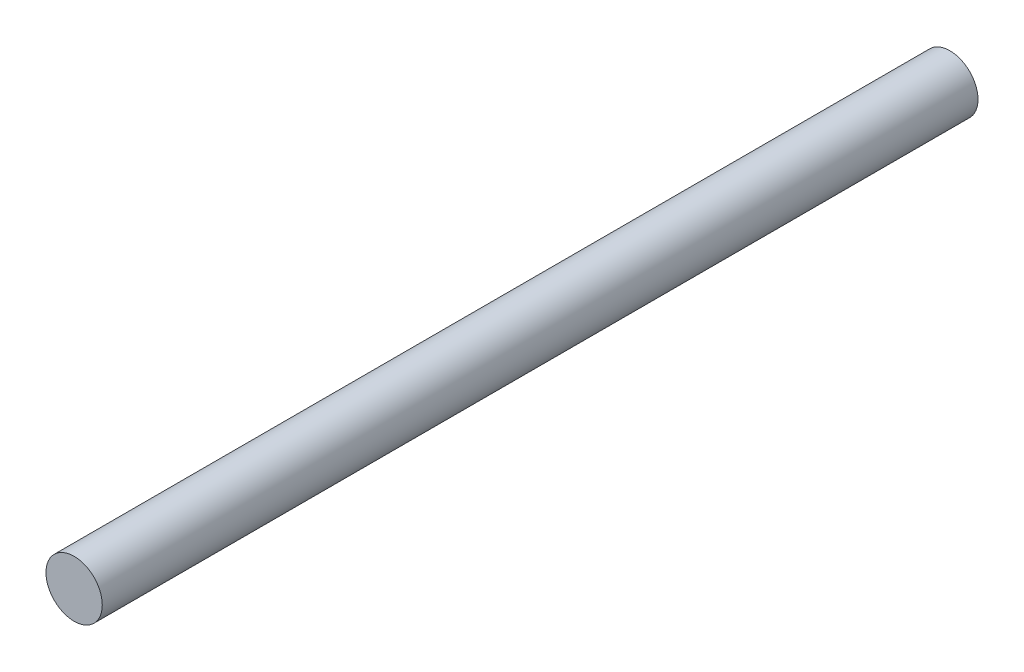
ISO-10303-21;
HEADER;
FILE_DESCRIPTION(('STEP AP214'),'2;1');
FILE_NAME('part.step','',(''),(''),'','','');
FILE_SCHEMA(('AUTOMOTIVE_DESIGN { 1 0 10303 214 1 1 1 1 }'));
ENDSEC;
DATA;
#1=APPLICATION_CONTEXT('core data for automotive mechanical design processes');
#2=APPLICATION_PROTOCOL_DEFINITION('international standard','automotive_design',2000,#1);
#3=PRODUCT_CONTEXT('',#1,'mechanical');
#4=PRODUCT('Part','Part','',(#3));
#5=PRODUCT_RELATED_PRODUCT_CATEGORY('part','',(#4));
#6=PRODUCT_DEFINITION_FORMATION('','',#4);
#7=PRODUCT_DEFINITION_CONTEXT('part definition',#1,'design');
#8=PRODUCT_DEFINITION('design','',#6,#7);
#9=PRODUCT_DEFINITION_SHAPE('','',#8);
#10=(LENGTH_UNIT() NAMED_UNIT(*) SI_UNIT(.MILLI.,.METRE.));
#11=(NAMED_UNIT(*) PLANE_ANGLE_UNIT() SI_UNIT($,.RADIAN.));
#12=(NAMED_UNIT(*) SI_UNIT($,.STERADIAN.) SOLID_ANGLE_UNIT());
#13=UNCERTAINTY_MEASURE_WITH_UNIT(LENGTH_MEASURE(1.E-05),#10,'distance_accuracy_value','');
#14=(GEOMETRIC_REPRESENTATION_CONTEXT(3) GLOBAL_UNCERTAINTY_ASSIGNED_CONTEXT((#13)) GLOBAL_UNIT_ASSIGNED_CONTEXT((#10,
#11,#12)) REPRESENTATION_CONTEXT('',''));
#15=CARTESIAN_POINT('',(0.,0.,0.));
#16=DIRECTION('',(0.,0.,1.));
#17=DIRECTION('',(1.,0.,0.));
#18=AXIS2_PLACEMENT_3D('',#15,#16,#17);
#19=CARTESIAN_POINT('',(0.,0.,-243.2));
#20=DIRECTION('',(0.,0.,1.));
#21=DIRECTION('',(1.,0.,0.));
#22=AXIS2_PLACEMENT_3D('',#19,#20,#21);
#23=CYLINDRICAL_SURFACE('',#22,8.89);
#24=CARTESIAN_POINT('',(0.,0.,-243.2));
#25=DIRECTION('',(0.,0.,1.));
#26=DIRECTION('',(1.,0.,0.));
#27=AXIS2_PLACEMENT_3D('',#24,#25,#26);
#28=CIRCLE('',#27,8.89);
#29=CARTESIAN_POINT('',(8.89,0.,-243.2));
#30=VERTEX_POINT('',#29);
#31=EDGE_CURVE('E10',#30,#30,#28,.T.);
#32=ORIENTED_EDGE('',*,*,#31,.T.);
#33=EDGE_LOOP('',(#32));
#34=FACE_BOUND('',#33,.T.);
#35=CARTESIAN_POINT('',(0.,0.,33.2));
#36=DIRECTION('',(0.,0.,1.));
#37=DIRECTION('',(1.,0.,0.));
#38=AXIS2_PLACEMENT_3D('',#35,#36,#37);
#39=CIRCLE('',#38,8.89);
#40=CARTESIAN_POINT('',(8.89,0.,33.2));
#41=VERTEX_POINT('',#40);
#42=EDGE_CURVE('E43',#41,#41,#39,.T.);
#43=ORIENTED_EDGE('',*,*,#42,.F.);
#44=EDGE_LOOP('',(#43));
#45=FACE_BOUND('',#44,.T.);
#46=ADVANCED_FACE('F37',(#34,#45),#23,.T.);
#47=CARTESIAN_POINT('',(0.,0.,-243.2));
#48=DIRECTION('',(0.,0.,1.));
#49=DIRECTION('',(1.,0.,0.));
#50=AXIS2_PLACEMENT_3D('',#47,#48,#49);
#51=PLANE('',#50);
#52=ORIENTED_EDGE('',*,*,#31,.F.);
#53=EDGE_LOOP('',(#52));
#54=FACE_BOUND('',#53,.T.);
#55=ADVANCED_FACE('F52',(#54),#51,.F.);
#56=CARTESIAN_POINT('',(0.,0.,33.2));
#57=DIRECTION('',(0.,0.,1.));
#58=DIRECTION('',(1.,0.,0.));
#59=AXIS2_PLACEMENT_3D('',#56,#57,#58);
#60=PLANE('',#59);
#61=ORIENTED_EDGE('',*,*,#42,.T.);
#62=EDGE_LOOP('',(#61));
#63=FACE_BOUND('',#62,.T.);
#64=ADVANCED_FACE('F49',(#63),#60,.T.);
#65=CLOSED_SHELL('',(#46,#55,#64));
#66=MANIFOLD_SOLID_BREP('B2',#65);
#67=ADVANCED_BREP_SHAPE_REPRESENTATION('',(#18,#66),#14);
#68=SHAPE_DEFINITION_REPRESENTATION(#9,#67);
ENDSEC;
END-ISO-10303-21;
